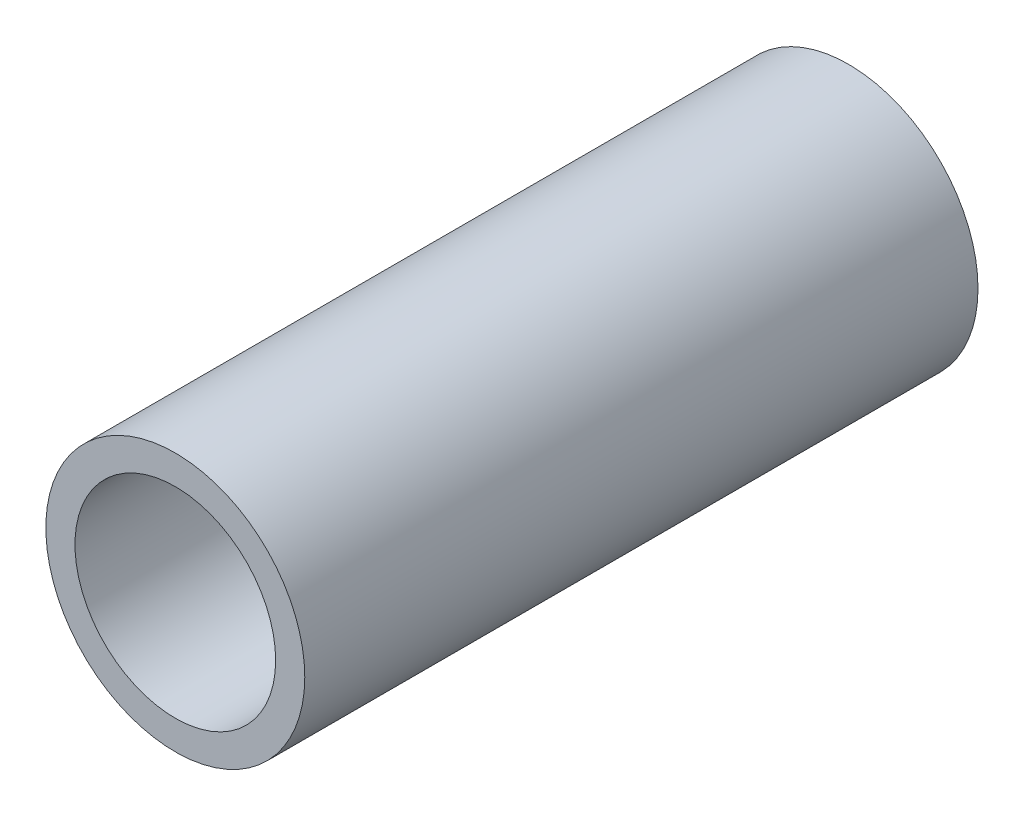
ISO-10303-21;
HEADER;
FILE_DESCRIPTION(('STEP AP214'),'2;1');
FILE_NAME('part.step','',(''),(''),'','','');
FILE_SCHEMA(('AUTOMOTIVE_DESIGN { 1 0 10303 214 1 1 1 1 }'));
ENDSEC;
DATA;
#1=APPLICATION_CONTEXT('core data for automotive mechanical design processes');
#2=APPLICATION_PROTOCOL_DEFINITION('international standard','automotive_design',2000,#1);
#3=PRODUCT_CONTEXT('',#1,'mechanical');
#4=PRODUCT('Part','Part','',(#3));
#5=PRODUCT_RELATED_PRODUCT_CATEGORY('part','',(#4));
#6=PRODUCT_DEFINITION_FORMATION('','',#4);
#7=PRODUCT_DEFINITION_CONTEXT('part definition',#1,'design');
#8=PRODUCT_DEFINITION('design','',#6,#7);
#9=PRODUCT_DEFINITION_SHAPE('','',#8);
#10=(LENGTH_UNIT() NAMED_UNIT(*) SI_UNIT(.MILLI.,.METRE.));
#11=(NAMED_UNIT(*) PLANE_ANGLE_UNIT() SI_UNIT($,.RADIAN.));
#12=(NAMED_UNIT(*) SI_UNIT($,.STERADIAN.) SOLID_ANGLE_UNIT());
#13=UNCERTAINTY_MEASURE_WITH_UNIT(LENGTH_MEASURE(1.E-05),#10,'distance_accuracy_value','');
#14=(GEOMETRIC_REPRESENTATION_CONTEXT(3) GLOBAL_UNCERTAINTY_ASSIGNED_CONTEXT((#13)) GLOBAL_UNIT_ASSIGNED_CONTEXT((#10,
#11,#12)) REPRESENTATION_CONTEXT('',''));
#15=CARTESIAN_POINT('',(0.,0.,0.));
#16=DIRECTION('',(0.,0.,1.));
#17=DIRECTION('',(1.,0.,0.));
#18=AXIS2_PLACEMENT_3D('',#15,#16,#17);
#19=CARTESIAN_POINT('',(0.,0.,5.2));
#20=DIRECTION('',(0.,0.,1.));
#21=DIRECTION('',(1.,0.,0.));
#22=AXIS2_PLACEMENT_3D('',#19,#20,#21);
#23=PLANE('',#22);
#24=CARTESIAN_POINT('',(0.,0.,5.2));
#25=DIRECTION('',(0.,0.,1.));
#26=DIRECTION('',(1.,0.,0.));
#27=AXIS2_PLACEMENT_3D('',#24,#25,#26);
#28=CIRCLE('',#27,1.);
#29=CARTESIAN_POINT('',(1.,0.,5.2));
#30=VERTEX_POINT('',#29);
#31=EDGE_CURVE('E10',#30,#30,#28,.T.);
#32=ORIENTED_EDGE('',*,*,#31,.T.);
#33=EDGE_LOOP('',(#32));
#34=FACE_BOUND('',#33,.T.);
#35=CARTESIAN_POINT('',(0.,0.,5.2));
#36=DIRECTION('',(0.,0.,1.));
#37=DIRECTION('',(1.,0.,0.));
#38=AXIS2_PLACEMENT_3D('',#35,#36,#37);
#39=CIRCLE('',#38,0.775);
#40=CARTESIAN_POINT('',(0.775,0.,5.2));
#41=VERTEX_POINT('',#40);
#42=EDGE_CURVE('E46',#41,#41,#39,.T.);
#43=ORIENTED_EDGE('',*,*,#42,.F.);
#44=EDGE_LOOP('',(#43));
#45=FACE_BOUND('',#44,.T.);
#46=ADVANCED_FACE('F35',(#34,#45),#23,.T.);
#47=CARTESIAN_POINT('',(0.,0.,0.));
#48=DIRECTION('',(0.,0.,1.));
#49=DIRECTION('',(1.,0.,0.));
#50=AXIS2_PLACEMENT_3D('',#47,#48,#49);
#51=PLANE('',#50);
#52=CARTESIAN_POINT('',(0.,0.,0.));
#53=DIRECTION('',(0.,0.,1.));
#54=DIRECTION('',(1.,0.,0.));
#55=AXIS2_PLACEMENT_3D('',#52,#53,#54);
#56=CIRCLE('',#55,1.);
#57=CARTESIAN_POINT('',(1.,0.,0.));
#58=VERTEX_POINT('',#57);
#59=EDGE_CURVE('E39',#58,#58,#56,.T.);
#60=ORIENTED_EDGE('',*,*,#59,.F.);
#61=EDGE_LOOP('',(#60));
#62=FACE_BOUND('',#61,.T.);
#63=CARTESIAN_POINT('',(0.,0.,0.));
#64=DIRECTION('',(0.,0.,1.));
#65=DIRECTION('',(1.,0.,0.));
#66=AXIS2_PLACEMENT_3D('',#63,#64,#65);
#67=CIRCLE('',#66,0.775);
#68=CARTESIAN_POINT('',(0.775,0.,0.));
#69=VERTEX_POINT('',#68);
#70=EDGE_CURVE('E48',#69,#69,#67,.T.);
#71=ORIENTED_EDGE('',*,*,#70,.T.);
#72=EDGE_LOOP('',(#71));
#73=FACE_BOUND('',#72,.T.);
#74=ADVANCED_FACE('F58',(#62,#73),#51,.F.);
#75=CARTESIAN_POINT('',(0.,0.,5.2));
#76=DIRECTION('',(0.,0.,-1.));
#77=DIRECTION('',(-1.,0.,0.));
#78=AXIS2_PLACEMENT_3D('',#75,#76,#77);
#79=CYLINDRICAL_SURFACE('',#78,1.);
#80=ORIENTED_EDGE('',*,*,#31,.F.);
#81=EDGE_LOOP('',(#80));
#82=FACE_BOUND('',#81,.T.);
#83=ORIENTED_EDGE('',*,*,#59,.T.);
#84=EDGE_LOOP('',(#83));
#85=FACE_BOUND('',#84,.T.);
#86=ADVANCED_FACE('F37',(#82,#85),#79,.T.);
#87=CARTESIAN_POINT('',(0.,0.,5.2));
#88=DIRECTION('',(0.,0.,-1.));
#89=DIRECTION('',(-1.,0.,0.));
#90=AXIS2_PLACEMENT_3D('',#87,#88,#89);
#91=CYLINDRICAL_SURFACE('',#90,0.775);
#92=ORIENTED_EDGE('',*,*,#42,.T.);
#93=EDGE_LOOP('',(#92));
#94=FACE_BOUND('',#93,.T.);
#95=ORIENTED_EDGE('',*,*,#70,.F.);
#96=EDGE_LOOP('',(#95));
#97=FACE_BOUND('',#96,.T.);
#98=ADVANCED_FACE('F54',(#94,#97),#91,.F.);
#99=CLOSED_SHELL('',(#46,#74,#86,#98));
#100=MANIFOLD_SOLID_BREP('B2',#99);
#101=ADVANCED_BREP_SHAPE_REPRESENTATION('',(#18,#100),#14);
#102=SHAPE_DEFINITION_REPRESENTATION(#9,#101);
ENDSEC;
END-ISO-10303-21;
